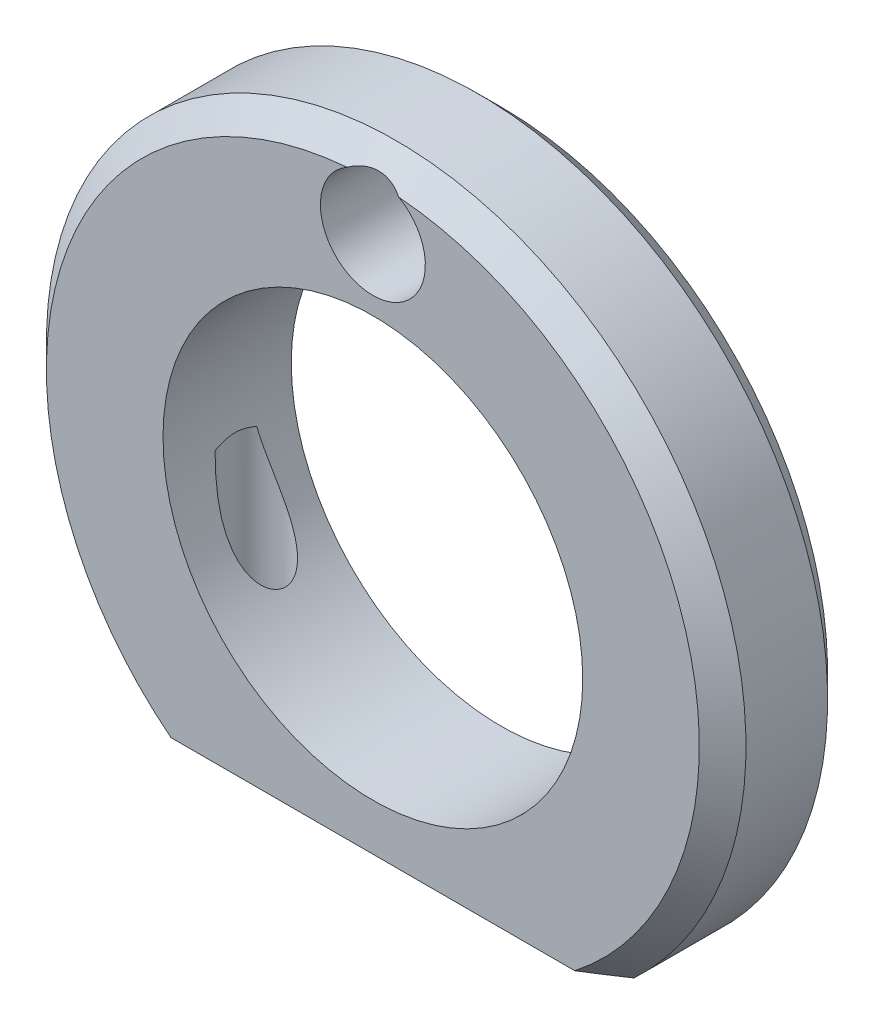
ISO-10303-21;
HEADER;
FILE_DESCRIPTION(('STEP AP214'),'2;1');
FILE_NAME('part.step','',(''),(''),'','','');
FILE_SCHEMA(('AUTOMOTIVE_DESIGN { 1 0 10303 214 1 1 1 1 }'));
ENDSEC;
DATA;
#1=APPLICATION_CONTEXT('core data for automotive mechanical design processes');
#2=APPLICATION_PROTOCOL_DEFINITION('international standard','automotive_design',2000,#1);
#3=PRODUCT_CONTEXT('',#1,'mechanical');
#4=PRODUCT('Part','Part','',(#3));
#5=PRODUCT_RELATED_PRODUCT_CATEGORY('part','',(#4));
#6=PRODUCT_DEFINITION_FORMATION('','',#4);
#7=PRODUCT_DEFINITION_CONTEXT('part definition',#1,'design');
#8=PRODUCT_DEFINITION('design','',#6,#7);
#9=PRODUCT_DEFINITION_SHAPE('','',#8);
#10=(LENGTH_UNIT() NAMED_UNIT(*) SI_UNIT(.MILLI.,.METRE.));
#11=(NAMED_UNIT(*) PLANE_ANGLE_UNIT() SI_UNIT($,.RADIAN.));
#12=(NAMED_UNIT(*) SI_UNIT($,.STERADIAN.) SOLID_ANGLE_UNIT());
#13=UNCERTAINTY_MEASURE_WITH_UNIT(LENGTH_MEASURE(1.E-05),#10,'distance_accuracy_value','');
#14=(GEOMETRIC_REPRESENTATION_CONTEXT(3) GLOBAL_UNCERTAINTY_ASSIGNED_CONTEXT((#13)) GLOBAL_UNIT_ASSIGNED_CONTEXT((#10,
#11,#12)) REPRESENTATION_CONTEXT('',''));
#15=CARTESIAN_POINT('',(0.,0.,0.));
#16=DIRECTION('',(0.,0.,1.));
#17=DIRECTION('',(1.,0.,0.));
#18=AXIS2_PLACEMENT_3D('',#15,#16,#17);
#19=CARTESIAN_POINT('',(0.,0.,-30.));
#20=DIRECTION('',(0.,0.,1.));
#21=DIRECTION('',(1.,0.,0.));
#22=AXIS2_PLACEMENT_3D('',#19,#20,#21);
#23=PLANE('',#22);
#24=CARTESIAN_POINT('',(0.,0.,-30.));
#25=DIRECTION('',(0.,0.,-1.));
#26=DIRECTION('',(-1.,0.,0.));
#27=AXIS2_PLACEMENT_3D('',#24,#25,#26);
#28=CIRCLE('',#27,9.);
#29=CARTESIAN_POINT('',(-9.,0.,-30.));
#30=VERTEX_POINT('',#29);
#31=EDGE_CURVE('E260',#30,#30,#28,.T.);
#32=ORIENTED_EDGE('',*,*,#31,.F.);
#33=EDGE_LOOP('',(#32));
#34=FACE_BOUND('',#33,.T.);
#35=CARTESIAN_POINT('',(0.,0.,-30.));
#36=DIRECTION('',(0.,0.,1.));
#37=DIRECTION('',(1.,0.,0.));
#38=AXIS2_PLACEMENT_3D('',#35,#36,#37);
#39=CIRCLE('',#38,14.);
#40=CARTESIAN_POINT('',(-8.66025403784439,-11.,-30.));
#41=VERTEX_POINT('',#40);
#42=CARTESIAN_POINT('',(-1.11248524783447,13.9557291666667,-30.));
#43=VERTEX_POINT('',#42);
#44=EDGE_CURVE('E52',#41,#43,#39,.F.);
#45=ORIENTED_EDGE('',*,*,#44,.T.);
#46=CARTESIAN_POINT('',(0.,12.,-30.));
#47=DIRECTION('',(0.,0.,1.));
#48=DIRECTION('',(1.,0.,0.));
#49=AXIS2_PLACEMENT_3D('',#46,#47,#48);
#50=CIRCLE('',#49,2.25);
#51=CARTESIAN_POINT('',(1.11248524783447,13.9557291666667,-30.));
#52=VERTEX_POINT('',#51);
#53=EDGE_CURVE('E64',#43,#52,#50,.T.);
#54=ORIENTED_EDGE('',*,*,#53,.T.);
#55=CARTESIAN_POINT('',(8.66025403784439,-11.,-30.));
#56=VERTEX_POINT('',#55);
#57=EDGE_CURVE('E112',#52,#56,#39,.F.);
#58=ORIENTED_EDGE('',*,*,#57,.T.);
#59=DIRECTION('',(1.,0.,0.));
#60=VECTOR('',#59,1.);
#61=CARTESIAN_POINT('',(-15.,-11.,-30.));
#62=LINE('',#61,#60);
#63=EDGE_CURVE('E181',#41,#56,#62,.T.);
#64=ORIENTED_EDGE('',*,*,#63,.F.);
#65=EDGE_LOOP('',(#45,#54,#58,#64));
#66=FACE_BOUND('',#65,.T.);
#67=ADVANCED_FACE('F38',(#34,#66),#23,.F.);
#68=CARTESIAN_POINT('',(0.,0.,-23.));
#69=DIRECTION('',(0.,0.,-1.));
#70=DIRECTION('',(-1.,0.,0.));
#71=AXIS2_PLACEMENT_3D('',#68,#69,#70);
#72=CYLINDRICAL_SURFACE('',#71,15.);
#73=DIRECTION('',(0.,0.,-1.));
#74=VECTOR('',#73,1.);
#75=CARTESIAN_POINT('',(-10.1980390271856,-11.,-23.));
#76=LINE('',#75,#74);
#77=CARTESIAN_POINT('',(-10.1980390271856,-11.,-29.));
#78=VERTEX_POINT('',#77);
#79=CARTESIAN_POINT('',(-10.1980390271856,-11.,-25.5));
#80=VERTEX_POINT('',#79);
#81=EDGE_CURVE('E179',#78,#80,#76,.F.);
#82=ORIENTED_EDGE('',*,*,#81,.T.);
#83=CARTESIAN_POINT('',(0.,0.,-25.5));
#84=DIRECTION('',(0.,0.,-1.));
#85=DIRECTION('',(-1.,0.,0.));
#86=AXIS2_PLACEMENT_3D('',#83,#84,#85);
#87=CIRCLE('',#86,15.);
#88=CARTESIAN_POINT('',(10.1980390271856,-11.,-25.5));
#89=VERTEX_POINT('',#88);
#90=EDGE_CURVE('E166',#80,#89,#87,.T.);
#91=ORIENTED_EDGE('',*,*,#90,.T.);
#92=DIRECTION('',(0.,0.,-1.));
#93=VECTOR('',#92,1.);
#94=CARTESIAN_POINT('',(10.1980390271856,-11.,-23.));
#95=LINE('',#94,#93);
#96=CARTESIAN_POINT('',(10.1980390271856,-11.,-29.));
#97=VERTEX_POINT('',#96);
#98=EDGE_CURVE('E175',#89,#97,#95,.T.);
#99=ORIENTED_EDGE('',*,*,#98,.T.);
#100=CARTESIAN_POINT('',(0.,0.,-29.));
#101=DIRECTION('',(0.,0.,1.));
#102=DIRECTION('',(1.,0.,0.));
#103=AXIS2_PLACEMENT_3D('',#100,#101,#102);
#104=CIRCLE('',#103,15.);
#105=EDGE_CURVE('E170',#97,#78,#104,.T.);
#106=ORIENTED_EDGE('',*,*,#105,.T.);
#107=EDGE_LOOP('',(#82,#91,#99,#106));
#108=FACE_BOUND('',#107,.T.);
#109=ADVANCED_FACE('F146',(#108),#72,.T.);
#110=CARTESIAN_POINT('',(-15.,-11.,-24.5));
#111=DIRECTION('',(0.,1.,0.));
#112=DIRECTION('',(0.,0.,1.));
#113=AXIS2_PLACEMENT_3D('',#110,#111,#112);
#114=PLANE('',#113);
#115=CARTESIAN_POINT('',(-8.,-11.,-27.5));
#116=DIRECTION('',(0.,-1.,0.));
#117=DIRECTION('',(0.,0.,-1.));
#118=AXIS2_PLACEMENT_3D('',#115,#116,#117);
#119=CIRCLE('',#118,1.24999999999999);
#120=CARTESIAN_POINT('',(-8.,-11.,-28.75));
#121=VERTEX_POINT('',#120);
#122=EDGE_CURVE('E195',#121,#121,#119,.T.);
#123=ORIENTED_EDGE('',*,*,#122,.F.);
#124=EDGE_LOOP('',(#123));
#125=FACE_BOUND('',#124,.T.);
#126=CARTESIAN_POINT('',(8.,-11.,-27.5));
#127=DIRECTION('',(0.,-1.,0.));
#128=DIRECTION('',(0.,0.,-1.));
#129=AXIS2_PLACEMENT_3D('',#126,#127,#128);
#130=CIRCLE('',#129,1.24999999999999);
#131=CARTESIAN_POINT('',(8.,-11.,-28.75));
#132=VERTEX_POINT('',#131);
#133=EDGE_CURVE('E189',#132,#132,#130,.T.);
#134=ORIENTED_EDGE('',*,*,#133,.F.);
#135=EDGE_LOOP('',(#134));
#136=FACE_BOUND('',#135,.T.);
#137=ORIENTED_EDGE('',*,*,#98,.F.);
#138=CARTESIAN_POINT('',(10.1980390271856,-11.,-25.5));
#139=CARTESIAN_POINT('',(10.0716097932226,-11.,-25.4140465014491));
#140=CARTESIAN_POINT('',(9.94478168559514,-11.,-25.3286777286267));
#141=CARTESIAN_POINT('',(9.69029386318123,-11.,-25.1592213451996));
#142=CARTESIAN_POINT('',(9.56263424634969,-11.,-25.0751335874483));
#143=CARTESIAN_POINT('',(9.30641873923805,-11.,-24.908329983576));
#144=CARTESIAN_POINT('',(9.17786283805277,-11.,-24.8256141541888));
#145=CARTESIAN_POINT('',(8.91978924484244,-11.,-24.6616638992506));
#146=CARTESIAN_POINT('',(8.79027144318523,-11.,-24.5804296463243));
#147=CARTESIAN_POINT('',(8.66025403784439,-11.,-24.5));
#148=B_SPLINE_CURVE_WITH_KNOTS('',3,(#138,#139,#140,#141,#142,#143,#144,#145,#146,#147),
.UNSPECIFIED.,.F.,.F.,(4,2,2,2,4),(0.,0.458640555019234,0.917228023923435,1.3758210822705,
1.83446723618274),.UNSPECIFIED.);
#149=CARTESIAN_POINT('',(8.66025403784439,-11.,-24.5));
#150=VERTEX_POINT('',#149);
#151=EDGE_CURVE('E124',#89,#150,#148,.T.);
#152=ORIENTED_EDGE('',*,*,#151,.T.);
#153=DIRECTION('',(1.,0.,0.));
#154=VECTOR('',#153,1.);
#155=CARTESIAN_POINT('',(-15.,-11.,-24.5));
#156=LINE('',#155,#154);
#157=CARTESIAN_POINT('',(-8.66025403784439,-11.,-24.5));
#158=VERTEX_POINT('',#157);
#159=EDGE_CURVE('E182',#158,#150,#156,.T.);
#160=ORIENTED_EDGE('',*,*,#159,.F.);
#161=CARTESIAN_POINT('',(-8.66025403784439,-11.,-24.5));
#162=CARTESIAN_POINT('',(-8.79027144318523,-11.,-24.5804296463243));
#163=CARTESIAN_POINT('',(-8.91978924484244,-11.,-24.6616638992506));
#164=CARTESIAN_POINT('',(-9.17786283805277,-11.,-24.8256141541888));
#165=CARTESIAN_POINT('',(-9.30641873923805,-11.,-24.908329983576));
#166=CARTESIAN_POINT('',(-9.56263424634969,-11.,-25.0751335874483));
#167=CARTESIAN_POINT('',(-9.69029386318122,-11.,-25.1592213451996));
#168=CARTESIAN_POINT('',(-9.94478168559514,-11.,-25.3286777286267));
#169=CARTESIAN_POINT('',(-10.0716097932226,-11.,-25.4140465014491));
#170=CARTESIAN_POINT('',(-10.1980390271856,-11.,-25.5));
#171=B_SPLINE_CURVE_WITH_KNOTS('',3,(#161,#162,#163,#164,#165,#166,#167,#168,#169,#170),
.UNSPECIFIED.,.F.,.F.,(4,2,2,2,4),(0.,0.458646153912242,0.917239212259307,1.37582668116351,
1.83446723618274),.UNSPECIFIED.);
#172=EDGE_CURVE('E131',#158,#80,#171,.T.);
#173=ORIENTED_EDGE('',*,*,#172,.T.);
#174=ORIENTED_EDGE('',*,*,#81,.F.);
#175=CARTESIAN_POINT('',(-10.1980390271856,-11.,-29.));
#176=CARTESIAN_POINT('',(-10.0716097932226,-11.,-29.0859534985509));
#177=CARTESIAN_POINT('',(-9.94478168559514,-11.,-29.1713222713733));
#178=CARTESIAN_POINT('',(-9.69029386318123,-11.,-29.3407786548004));
#179=CARTESIAN_POINT('',(-9.56263424634969,-11.,-29.4248664125517));
#180=CARTESIAN_POINT('',(-9.30641873923805,-11.,-29.591670016424));
#181=CARTESIAN_POINT('',(-9.17786283805277,-11.,-29.6743858458112));
#182=CARTESIAN_POINT('',(-8.91978924484244,-11.,-29.8383361007494));
#183=CARTESIAN_POINT('',(-8.79027144318522,-11.,-29.9195703536757));
#184=CARTESIAN_POINT('',(-8.66025403784439,-11.,-30.));
#185=B_SPLINE_CURVE_WITH_KNOTS('',3,(#175,#176,#177,#178,#179,#180,#181,#182,#183,#184),
.UNSPECIFIED.,.F.,.F.,(4,2,2,2,4),(0.,0.458640555019234,0.917228023923435,1.3758210822705,
1.83446723618274),.UNSPECIFIED.);
#186=EDGE_CURVE('E159',#78,#41,#185,.T.);
#187=ORIENTED_EDGE('',*,*,#186,.T.);
#188=ORIENTED_EDGE('',*,*,#63,.T.);
#189=CARTESIAN_POINT('',(8.66025403784439,-11.,-30.));
#190=CARTESIAN_POINT('',(8.79027144318522,-11.,-29.9195703536757));
#191=CARTESIAN_POINT('',(8.91978924484244,-11.,-29.8383361007494));
#192=CARTESIAN_POINT('',(9.17786283805277,-11.,-29.6743858458112));
#193=CARTESIAN_POINT('',(9.30641873923805,-11.,-29.591670016424));
#194=CARTESIAN_POINT('',(9.56263424634969,-11.,-29.4248664125517));
#195=CARTESIAN_POINT('',(9.69029386318123,-11.,-29.3407786548004));
#196=CARTESIAN_POINT('',(9.94478168559515,-11.,-29.1713222713733));
#197=CARTESIAN_POINT('',(10.0716097932226,-11.,-29.0859534985509));
#198=CARTESIAN_POINT('',(10.1980390271856,-11.,-29.));
#199=B_SPLINE_CURVE_WITH_KNOTS('',3,(#189,#190,#191,#192,#193,#194,#195,#196,#197,#198),
.UNSPECIFIED.,.F.,.F.,(4,2,2,2,4),(0.,0.458646153912241,0.917239212259307,1.37582668116351,
1.83446723618274),.UNSPECIFIED.);
#200=EDGE_CURVE('E118',#56,#97,#199,.T.);
#201=ORIENTED_EDGE('',*,*,#200,.T.);
#202=EDGE_LOOP('',(#137,#152,#160,#173,#174,#187,#188,#201));
#203=FACE_BOUND('',#202,.T.);
#204=ADVANCED_FACE('F140',(#125,#136,#203),#114,.F.);
#205=CARTESIAN_POINT('',(8.,-1.50000000000002,-27.5));
#206=DIRECTION('',(0.,-1.,0.));
#207=DIRECTION('',(0.,0.,-1.));
#208=AXIS2_PLACEMENT_3D('',#205,#206,#207);
#209=CONICAL_SURFACE('',#208,1.25,1.02974425867665);
#210=CARTESIAN_POINT('',(8.,-1.50000000000002,-27.5));
#211=DIRECTION('',(0.,-1.,0.));
#212=DIRECTION('',(0.,0.,-1.));
#213=AXIS2_PLACEMENT_3D('',#210,#211,#212);
#214=CIRCLE('',#213,1.25);
#215=CARTESIAN_POINT('',(8.87411967464942,-1.50000000000002,-28.3935405947078));
#216=VERTEX_POINT('',#215);
#217=CARTESIAN_POINT('',(8.87411967464942,-1.50000000000002,-26.6064594052922));
#218=VERTEX_POINT('',#217);
#219=EDGE_CURVE('E185',#216,#218,#214,.T.);
#220=ORIENTED_EDGE('',*,*,#219,.T.);
#221=CARTESIAN_POINT('',(8.86106122519498,-1.57530757737848,-26.4275663046257));
#222=CARTESIAN_POINT('',(8.86361566752957,-1.56094003834773,-26.4602890018099));
#223=CARTESIAN_POINT('',(8.86609058147292,-1.54681453610574,-26.4931239838151));
#224=CARTESIAN_POINT('',(8.87087174635954,-1.51915470452756,-26.559063843349));
#225=CARTESIAN_POINT('',(8.87317795349055,-1.5056205291207,-26.5921687885222));
#226=CARTESIAN_POINT('',(8.87984990162628,-1.4659415614311,-26.6922721352683));
#227=CARTESIAN_POINT('',(8.88394254666435,-1.4408700172651,-26.7597241566238));
#228=CARTESIAN_POINT('',(8.89123578849562,-1.39515452702232,-26.8953921180772));
#229=CARTESIAN_POINT('',(8.89444536076115,-1.37446656409503,-26.9635924372257));
#230=CARTESIAN_POINT('',(8.8998432520033,-1.33907222296339,-27.1014942553577));
#231=CARTESIAN_POINT('',(8.90203360474662,-1.32435394036727,-27.1711924719693));
#232=CARTESIAN_POINT('',(8.90480765394282,-1.30555302442072,-27.2946804252001));
#233=CARTESIAN_POINT('',(8.90565312498818,-1.29975056316816,-27.3481970376761));
#234=CARTESIAN_POINT('',(8.90658287025973,-1.29336510130989,-27.4555565941321));
#235=CARTESIAN_POINT('',(8.90666721269013,-1.2927816330338,-27.5093995084397));
#236=CARTESIAN_POINT('',(8.90606712586658,-1.29690857674494,-27.6169138398362));
#237=CARTESIAN_POINT('',(8.90538206378273,-1.30162334649805,-27.6705850792886));
#238=CARTESIAN_POINT('',(8.90329669120279,-1.31581070616334,-27.777277081794));
#239=CARTESIAN_POINT('',(8.90189613544496,-1.32528492753385,-27.8302976154076));
#240=CARTESIAN_POINT('',(8.89823890619905,-1.34963458663474,-27.9424520793815));
#241=CARTESIAN_POINT('',(8.89589311023684,-1.36506099471586,-28.0014606615901));
#242=CARTESIAN_POINT('',(8.8905197062628,-1.39963051090123,-28.1183604287142));
#243=CARTESIAN_POINT('',(8.88749165652942,-1.41877602580943,-28.1762508632087));
#244=CARTESIAN_POINT('',(8.88085338113834,-1.45975044087702,-28.2910586983109));
#245=CARTESIAN_POINT('',(8.87724283945837,-1.48158079611952,-28.3479755520721));
#246=CARTESIAN_POINT('',(8.86951569004325,-1.52716672313604,-28.4608468301184));
#247=CARTESIAN_POINT('',(8.8654002893288,-1.55091765852062,-28.5168031989002));
#248=CARTESIAN_POINT('',(8.86106122519498,-1.57530757737846,-28.5724336953742));
#249=B_SPLINE_CURVE_WITH_KNOTS('',3,(#221,#222,#223,#224,#225,#226,#227,#228,#229,#230,#231,
#232,#233,#234,#235,#236,#237,#238,#239,#240,#241,#242,#243,#244,#245,#246,#247,#248),
.UNSPECIFIED.,.F.,.F.,(4,2,2,2,2,2,2,2,2,2,2,2,2,4),(0.,0.107484795997813,0.21499740685303,
0.43112518645645,0.644967483157521,0.858381226150281,1.01966031237344,1.18092494634404,
1.34232231655745,1.50377504880878,1.68671209699813,1.86976792889765,2.05292341105545,
2.23564923905379),.UNSPECIFIED.);
#250=EDGE_CURVE('E198',#218,#216,#249,.T.);
#251=ORIENTED_EDGE('',*,*,#250,.T.);
#252=EDGE_LOOP('',(#220,#251));
#253=FACE_BOUND('',#252,.T.);
#254=ADVANCED_FACE('F145',(#253),#209,.F.);
#255=CARTESIAN_POINT('',(8.,-11.,-27.5));
#256=DIRECTION('',(0.,-1.,0.));
#257=DIRECTION('',(0.,0.,-1.));
#258=AXIS2_PLACEMENT_3D('',#255,#256,#257);
#259=CYLINDRICAL_SURFACE('',#258,1.24999999999999);
#260=ORIENTED_EDGE('',*,*,#219,.F.);
#261=CARTESIAN_POINT('',(8.87411967464942,-1.50000000000002,-28.3935405947078));
#262=CARTESIAN_POINT('',(8.85708328523695,-1.6007755749857,-28.4102155974332));
#263=CARTESIAN_POINT('',(8.83835554615178,-1.70113872994846,-28.4275735857014));
#264=CARTESIAN_POINT('',(8.79752008243259,-1.90106765132002,-28.4629054350056));
#265=CARTESIAN_POINT('',(8.77541232661505,-2.00063341036326,-28.4808793017224));
#266=CARTESIAN_POINT('',(8.70385384490105,-2.29888060983939,-28.5347268180978));
#267=CARTESIAN_POINT('',(8.64928941017002,-2.49639332409706,-28.5703967028258));
#268=CARTESIAN_POINT('',(8.52431976444913,-2.89500688881718,-28.6370109661542));
#269=CARTESIAN_POINT('',(8.45342967450551,-3.09599366382335,-28.6677478792078));
#270=CARTESIAN_POINT('',(8.33615429625324,-3.3940998035778,-28.7046459380422));
#271=CARTESIAN_POINT('',(8.29527458916372,-3.49283190549684,-28.7154060168352));
#272=CARTESIAN_POINT('',(8.2098894739385,-3.68905915831004,-28.7330239431371));
#273=CARTESIAN_POINT('',(8.165384906513,-3.78655458999567,-28.7398826925479));
#274=CARTESIAN_POINT('',(8.07334229593198,-3.97899370523011,-28.7486931227266));
#275=CARTESIAN_POINT('',(8.02584402675978,-4.07395375798958,-28.7506991573559));
#276=CARTESIAN_POINT('',(7.92754897671645,-4.26206757611571,-28.7488663624839));
#277=CARTESIAN_POINT('',(7.87675363631021,-4.35522210750634,-28.7450300692132));
#278=CARTESIAN_POINT('',(7.77263043180039,-4.53841490538821,-28.7302615672639));
#279=CARTESIAN_POINT('',(7.71933055222094,-4.62847411161763,-28.719395762287));
#280=CARTESIAN_POINT('',(7.61033057764768,-4.80558597309028,-28.6890572263881));
#281=CARTESIAN_POINT('',(7.55463293321618,-4.8926415414956,-28.6695931030931));
#282=CARTESIAN_POINT('',(7.44756877966817,-5.05391844926578,-28.6226632925019));
#283=CARTESIAN_POINT('',(7.39635182913236,-5.12853471600345,-28.5962362484831));
#284=CARTESIAN_POINT('',(7.29368403850661,-5.27352499250148,-28.5330814793777));
#285=CARTESIAN_POINT('',(7.24223293142836,-5.34388880825062,-28.4963301090838));
#286=CARTESIAN_POINT('',(7.14041748909151,-5.47920538204426,-28.410022795025));
#287=CARTESIAN_POINT('',(7.09007655919198,-5.54407417126059,-28.3603037744454));
#288=CARTESIAN_POINT('',(6.99454613026873,-5.66411052189057,-28.2463480666901));
#289=CARTESIAN_POINT('',(6.9493351104457,-5.71931918149558,-28.1821756772732));
#290=CARTESIAN_POINT('',(6.88612727722796,-5.79504770014483,-28.0692245541152));
#291=CARTESIAN_POINT('',(6.86473990234609,-5.82032815276168,-28.0255268342084));
#292=CARTESIAN_POINT('',(6.82648544946824,-5.86514780552809,-27.9334098844887));
#293=CARTESIAN_POINT('',(6.80961591930785,-5.88469012074157,-27.8849932355279));
#294=CARTESIAN_POINT('',(6.78152083944794,-5.91704711501855,-27.7838699958307));
#295=CARTESIAN_POINT('',(6.77034490696607,-5.92980269185769,-27.7311301908117));
#296=CARTESIAN_POINT('',(6.75491526698757,-5.94737446502618,-27.6233593114046));
#297=CARTESIAN_POINT('',(6.75065590871298,-5.95219714250368,-27.5683301451443));
#298=CARTESIAN_POINT('',(6.74955513456626,-5.95344450624295,-27.4648082390818));
#299=CARTESIAN_POINT('',(6.75187693980968,-5.95081651701455,-27.4163319430734));
#300=CARTESIAN_POINT('',(6.76198982631269,-5.93932246663234,-27.3207202606378));
#301=CARTESIAN_POINT('',(6.76978083127581,-5.9304564924997,-27.2735848555144));
#302=CARTESIAN_POINT('',(6.79002457882441,-5.90726615786427,-27.1828609147258));
#303=CARTESIAN_POINT('',(6.8023758992209,-5.89306043839874,-27.1392186533023));
#304=CARTESIAN_POINT('',(6.83098204361698,-5.85987754338299,-27.0551726476339));
#305=CARTESIAN_POINT('',(6.8472383828719,-5.84089851552241,-27.0147701686514));
#306=CARTESIAN_POINT('',(6.89099309420711,-5.78928397123099,-26.9199698019241));
#307=CARTESIAN_POINT('',(6.92023406769393,-5.75437107560637,-26.8676133155812));
#308=CARTESIAN_POINT('',(6.98303449192455,-5.67800065704733,-26.7708737998814));
#309=CARTESIAN_POINT('',(7.01660350986967,-5.63652858749242,-26.72650897323));
#310=CARTESIAN_POINT('',(7.10285868224077,-5.52776561919175,-26.6259989700178));
#311=CARTESIAN_POINT('',(7.15704001136858,-5.45758009537778,-26.5742951459052));
#312=CARTESIAN_POINT('',(7.26713457811662,-5.31011174866885,-26.4848869012029));
#313=CARTESIAN_POINT('',(7.32305098128383,-5.23281537827303,-26.447209923295));
#314=CARTESIAN_POINT('',(7.42535836799345,-5.0863252750604,-26.3886198267418));
#315=CARTESIAN_POINT('',(7.4718225643357,-5.01785227997352,-26.3659784714355));
#316=CARTESIAN_POINT('',(7.56368795346398,-4.87827946301278,-26.3275610278762));
#317=CARTESIAN_POINT('',(7.60908838989865,-4.80717785952706,-26.3117896920706));
#318=CARTESIAN_POINT('',(7.69836049844633,-4.66288066996903,-26.2860502466067));
#319=CARTESIAN_POINT('',(7.74222996682389,-4.58968232091245,-26.2760902022262));
#320=CARTESIAN_POINT('',(7.82808011145286,-4.44167660634974,-26.2611133040344));
#321=CARTESIAN_POINT('',(7.87006007410449,-4.36686864845668,-26.2560983030882));
#322=CARTESIAN_POINT('',(7.98762681311368,-4.1501344551804,-26.2476960913835));
#323=CARTESIAN_POINT('',(8.06059241842558,-4.00657252613277,-26.2495430598587));
#324=CARTESIAN_POINT('',(8.19854202015398,-3.71615674617172,-26.2639233429438));
#325=CARTESIAN_POINT('',(8.26351866126316,-3.56930000668576,-26.2764664222273));
#326=CARTESIAN_POINT('',(8.38539505310234,-3.27275175073386,-26.3092198048271));
#327=CARTESIAN_POINT('',(8.44227613290657,-3.12305455565661,-26.3294474495327));
#328=CARTESIAN_POINT('',(8.5477447019725,-2.8216230660789,-26.3749352586297));
#329=CARTESIAN_POINT('',(8.59633544743443,-2.66988959674315,-26.4001934386868));
#330=CARTESIAN_POINT('',(8.68968149811894,-2.34945933835957,-26.4559350073354));
#331=CARTESIAN_POINT('',(8.73358915250647,-2.18056229674849,-26.4866879880508));
#332=CARTESIAN_POINT('',(8.79192570677171,-1.92602135509888,-26.5325487115759));
#333=CARTESIAN_POINT('',(8.81007421561503,-1.84122871737723,-26.5477460891529));
#334=CARTESIAN_POINT('',(8.84392954208174,-1.67105705152311,-26.5776148593848));
#335=CARTESIAN_POINT('',(8.85963612317073,-1.58567796742057,-26.59228620098));
#336=CARTESIAN_POINT('',(8.87411967464942,-1.50000000000002,-26.6064594052922));
#337=B_SPLINE_CURVE_WITH_KNOTS('',3,(#261,#262,#263,#264,#265,#266,#267,#268,#269,#270,#271,
#272,#273,#274,#275,#276,#277,#278,#279,#280,#281,#282,#283,#284,#285,#286,#287,#288,#289,#290,
#291,#292,#293,#294,#295,#296,#297,#298,#299,#300,#301,#302,#303,#304,#305,#306,#307,#308,#309,
#310,#311,#312,#313,#314,#315,#316,#317,#318,#319,#320,#321,#322,#323,#324,#325,#326,#327,#328,
#329,#330,#331,#332,#333,#334,#335,#336),.UNSPECIFIED.,.F.,.F.,(4,2,2,2,2,2,2,2,2,2,2,2,2,2,2,2,
2,2,2,2,2,2,2,2,2,2,2,2,2,2,2,2,2,2,2,2,2,4),(0.,0.310631637156385,0.621266140325088,
1.24475142220558,1.8899184443281,2.21200932792036,2.53402572086116,2.85241825048372,
3.17067260115902,3.48596363908503,3.80093975738901,4.08326410499949,4.36624039028637,
4.65296296322747,4.93843435963055,5.10234609950026,5.26616869135074,5.43139550026636,
5.59648725234872,5.74156233820096,5.88663540026624,6.028659314912,6.17073842803876,
6.37774327121526,6.58521380903381,6.89141847932309,7.19821911110901,7.4552312436013,
7.71242088714413,7.96996663086809,8.22760883812741,8.70995030699621,9.19273258613571,
9.67661087138331,10.1602986637118,10.6915726954795,10.955645804923,11.2197444775744),.UNSPECIFIED.);
#338=EDGE_CURVE('E206',#216,#218,#337,.T.);
#339=ORIENTED_EDGE('',*,*,#338,.T.);
#340=EDGE_LOOP('',(#260,#339));
#341=FACE_BOUND('',#340,.T.);
#342=ORIENTED_EDGE('',*,*,#133,.T.);
#343=EDGE_LOOP('',(#342));
#344=FACE_BOUND('',#343,.T.);
#345=ADVANCED_FACE('F241',(#341,#344),#259,.F.);
#346=CARTESIAN_POINT('',(-8.,-1.50000000000002,-27.5));
#347=DIRECTION('',(0.,-1.,0.));
#348=DIRECTION('',(0.,0.,-1.));
#349=AXIS2_PLACEMENT_3D('',#346,#347,#348);
#350=CONICAL_SURFACE('',#349,1.25,1.02974425867665);
#351=CARTESIAN_POINT('',(-8.,-1.50000000000002,-27.5));
#352=DIRECTION('',(0.,-1.,0.));
#353=DIRECTION('',(0.,0.,-1.));
#354=AXIS2_PLACEMENT_3D('',#351,#352,#353);
#355=CIRCLE('',#354,1.25);
#356=CARTESIAN_POINT('',(-8.87411967464942,-1.50000000000002,-26.6064594052922));
#357=VERTEX_POINT('',#356);
#358=CARTESIAN_POINT('',(-8.87411967464942,-1.50000000000002,-28.3935405947078));
#359=VERTEX_POINT('',#358);
#360=EDGE_CURVE('E192',#357,#359,#355,.T.);
#361=ORIENTED_EDGE('',*,*,#360,.T.);
#362=CARTESIAN_POINT('',(-8.86106122519498,-1.57530757737846,-28.5724336953742));
#363=CARTESIAN_POINT('',(-8.86361566752957,-1.56094003834771,-28.5397109981901));
#364=CARTESIAN_POINT('',(-8.86609058147292,-1.54681453610573,-28.5068760161848));
#365=CARTESIAN_POINT('',(-8.87087174635954,-1.51915470452754,-28.440936156651));
#366=CARTESIAN_POINT('',(-8.87317795349055,-1.50562052912068,-28.4078312114778));
#367=CARTESIAN_POINT('',(-8.87984990162628,-1.46594156143109,-28.3077278647317));
#368=CARTESIAN_POINT('',(-8.88394254666436,-1.44087001726509,-28.2402758433762));
#369=CARTESIAN_POINT('',(-8.89123578849562,-1.3951545270223,-28.1046078819227));
#370=CARTESIAN_POINT('',(-8.89444536076115,-1.37446656409502,-28.0364075627743));
#371=CARTESIAN_POINT('',(-8.8998432520033,-1.33907222296338,-27.8985057446422));
#372=CARTESIAN_POINT('',(-8.90203360474662,-1.32435394036726,-27.8288075280307));
#373=CARTESIAN_POINT('',(-8.90480765394282,-1.30555302442071,-27.7053195747999));
#374=CARTESIAN_POINT('',(-8.90565312498818,-1.29975056316816,-27.6518029623239));
#375=CARTESIAN_POINT('',(-8.90658287025973,-1.29336510130989,-27.5444434058679));
#376=CARTESIAN_POINT('',(-8.90666721269013,-1.2927816330338,-27.4906004915603));
#377=CARTESIAN_POINT('',(-8.90606712586657,-1.29690857674494,-27.3830861601638));
#378=CARTESIAN_POINT('',(-8.90538206378273,-1.30162334649806,-27.3294149207114));
#379=CARTESIAN_POINT('',(-8.90329669120279,-1.31581070616334,-27.222722918206));
#380=CARTESIAN_POINT('',(-8.90189613544496,-1.32528492753385,-27.1697023845924));
#381=CARTESIAN_POINT('',(-8.89823890619905,-1.34963458663475,-27.0575479206184));
#382=CARTESIAN_POINT('',(-8.89589311023684,-1.36506099471587,-26.9985393384099));
#383=CARTESIAN_POINT('',(-8.8905197062628,-1.39963051090124,-26.8816395712858));
#384=CARTESIAN_POINT('',(-8.88749165652942,-1.41877602580945,-26.8237491367913));
#385=CARTESIAN_POINT('',(-8.88085338113834,-1.45975044087703,-26.708941301689));
#386=CARTESIAN_POINT('',(-8.87724283945837,-1.48158079611954,-26.6520244479279));
#387=CARTESIAN_POINT('',(-8.86951569004325,-1.52716672313605,-26.5391531698816));
#388=CARTESIAN_POINT('',(-8.86540028932879,-1.55091765852064,-26.4831968010997));
#389=CARTESIAN_POINT('',(-8.86106122519498,-1.57530757737848,-26.4275663046257));
#390=B_SPLINE_CURVE_WITH_KNOTS('',3,(#362,#363,#364,#365,#366,#367,#368,#369,#370,#371,#372,
#373,#374,#375,#376,#377,#378,#379,#380,#381,#382,#383,#384,#385,#386,#387,#388,#389),
.UNSPECIFIED.,.F.,.F.,(4,2,2,2,2,2,2,2,2,2,2,2,2,4),(0.,0.107484795997809,0.214997406853026,
0.431125186456445,0.644967483157522,0.85838122615027,1.01966031237343,1.18092494634404,
1.34232231655745,1.50377504880878,1.68671209699812,1.86976792889765,2.05292341105545,
2.23564923905379),.UNSPECIFIED.);
#391=EDGE_CURVE('E230',#359,#357,#390,.T.);
#392=ORIENTED_EDGE('',*,*,#391,.T.);
#393=EDGE_LOOP('',(#361,#392));
#394=FACE_BOUND('',#393,.T.);
#395=ADVANCED_FACE('F237',(#394),#350,.F.);
#396=CARTESIAN_POINT('',(-8.,-11.,-27.5));
#397=DIRECTION('',(0.,-1.,0.));
#398=DIRECTION('',(0.,0.,-1.));
#399=AXIS2_PLACEMENT_3D('',#396,#397,#398);
#400=CYLINDRICAL_SURFACE('',#399,1.24999999999999);
#401=ORIENTED_EDGE('',*,*,#360,.F.);
#402=CARTESIAN_POINT('',(-8.87411967464942,-1.50000000000002,-26.6064594052922));
#403=CARTESIAN_POINT('',(-8.85708328523695,-1.6007755749857,-26.5897844025668));
#404=CARTESIAN_POINT('',(-8.83835554615178,-1.70113872994846,-26.5724264142986));
#405=CARTESIAN_POINT('',(-8.79752008243259,-1.90106765132002,-26.5370945649944));
#406=CARTESIAN_POINT('',(-8.77541232661505,-2.00063341036326,-26.5191206982776));
#407=CARTESIAN_POINT('',(-8.70385384490105,-2.29888060983939,-26.4652731819022));
#408=CARTESIAN_POINT('',(-8.64928941017002,-2.49639332409706,-26.4296032971742));
#409=CARTESIAN_POINT('',(-8.52431976444913,-2.89500688881718,-26.3629890338458));
#410=CARTESIAN_POINT('',(-8.45342967450551,-3.09599366382335,-26.3322521207922));
#411=CARTESIAN_POINT('',(-8.33615429625324,-3.3940998035778,-26.2953540619578));
#412=CARTESIAN_POINT('',(-8.29527458916372,-3.49283190549684,-26.2845939831648));
#413=CARTESIAN_POINT('',(-8.2098894739385,-3.68905915831004,-26.2669760568629));
#414=CARTESIAN_POINT('',(-8.165384906513,-3.78655458999567,-26.2601173074521));
#415=CARTESIAN_POINT('',(-8.07334229593198,-3.97899370523011,-26.2513068772734));
#416=CARTESIAN_POINT('',(-8.02584402675978,-4.07395375798958,-26.2493008426441));
#417=CARTESIAN_POINT('',(-7.92754897671645,-4.26206757611571,-26.2511336375161));
#418=CARTESIAN_POINT('',(-7.87675363631021,-4.35522210750634,-26.2549699307868));
#419=CARTESIAN_POINT('',(-7.77263043180039,-4.53841490538821,-26.2697384327361));
#420=CARTESIAN_POINT('',(-7.71933055222094,-4.62847411161763,-26.280604237713));
#421=CARTESIAN_POINT('',(-7.61033057764768,-4.80558597309028,-26.3109427736119));
#422=CARTESIAN_POINT('',(-7.55463293321618,-4.8926415414956,-26.3304068969069));
#423=CARTESIAN_POINT('',(-7.44756877966817,-5.05391844926578,-26.3773367074981));
#424=CARTESIAN_POINT('',(-7.39635182913236,-5.12853471600345,-26.4037637515169));
#425=CARTESIAN_POINT('',(-7.29368403850661,-5.27352499250148,-26.4669185206223));
#426=CARTESIAN_POINT('',(-7.24223293142836,-5.34388880825062,-26.5036698909162));
#427=CARTESIAN_POINT('',(-7.14041748909151,-5.47920538204426,-26.589977204975));
#428=CARTESIAN_POINT('',(-7.09007655919198,-5.54407417126059,-26.6396962255546));
#429=CARTESIAN_POINT('',(-6.99454613026873,-5.66411052189057,-26.7536519333099));
#430=CARTESIAN_POINT('',(-6.9493351104457,-5.71931918149558,-26.8178243227268));
#431=CARTESIAN_POINT('',(-6.88612727722796,-5.79504770014483,-26.9307754458848));
#432=CARTESIAN_POINT('',(-6.86473990234609,-5.82032815276168,-26.9744731657916));
#433=CARTESIAN_POINT('',(-6.82648544946824,-5.86514780552809,-27.0665901155113));
#434=CARTESIAN_POINT('',(-6.80961591930785,-5.88469012074157,-27.1150067644721));
#435=CARTESIAN_POINT('',(-6.78152083944794,-5.91704711501855,-27.2161300041693));
#436=CARTESIAN_POINT('',(-6.77034490696607,-5.92980269185769,-27.2688698091883));
#437=CARTESIAN_POINT('',(-6.75491526698757,-5.94737446502618,-27.3766406885954));
#438=CARTESIAN_POINT('',(-6.75065590871298,-5.95219714250368,-27.4316698548557));
#439=CARTESIAN_POINT('',(-6.74955513456626,-5.95344450624295,-27.5351917609182));
#440=CARTESIAN_POINT('',(-6.75187693980968,-5.95081651701455,-27.5836680569266));
#441=CARTESIAN_POINT('',(-6.76198982631269,-5.93932246663234,-27.6792797393622));
#442=CARTESIAN_POINT('',(-6.76978083127581,-5.9304564924997,-27.7264151444856));
#443=CARTESIAN_POINT('',(-6.79002457882441,-5.90726615786427,-27.8171390852742));
#444=CARTESIAN_POINT('',(-6.8023758992209,-5.89306043839874,-27.8607813466977));
#445=CARTESIAN_POINT('',(-6.83098204361698,-5.85987754338299,-27.9448273523661));
#446=CARTESIAN_POINT('',(-6.8472383828719,-5.84089851552241,-27.9852298313486));
#447=CARTESIAN_POINT('',(-6.89099309420711,-5.78928397123099,-28.0800301980759));
#448=CARTESIAN_POINT('',(-6.92023406769393,-5.75437107560637,-28.1323866844188));
#449=CARTESIAN_POINT('',(-6.98303449192455,-5.67800065704733,-28.2291262001186));
#450=CARTESIAN_POINT('',(-7.01660350986967,-5.63652858749242,-28.27349102677));
#451=CARTESIAN_POINT('',(-7.10285868224077,-5.52776561919175,-28.3740010299822));
#452=CARTESIAN_POINT('',(-7.15704001136858,-5.45758009537778,-28.4257048540948));
#453=CARTESIAN_POINT('',(-7.26713457811662,-5.31011174866885,-28.5151130987971));
#454=CARTESIAN_POINT('',(-7.32305098128383,-5.23281537827302,-28.552790076705));
#455=CARTESIAN_POINT('',(-7.42535836799345,-5.0863252750604,-28.6113801732582));
#456=CARTESIAN_POINT('',(-7.4718225643357,-5.01785227997352,-28.6340215285645));
#457=CARTESIAN_POINT('',(-7.56368795346398,-4.87827946301278,-28.6724389721238));
#458=CARTESIAN_POINT('',(-7.60908838989865,-4.80717785952706,-28.6882103079294));
#459=CARTESIAN_POINT('',(-7.69836049844633,-4.66288066996903,-28.7139497533933));
#460=CARTESIAN_POINT('',(-7.74222996682389,-4.58968232091245,-28.7239097977738));
#461=CARTESIAN_POINT('',(-7.82808011145286,-4.44167660634974,-28.7388866959656));
#462=CARTESIAN_POINT('',(-7.87006007410449,-4.36686864845668,-28.7439016969118));
#463=CARTESIAN_POINT('',(-7.98762681311368,-4.1501344551804,-28.7523039086165));
#464=CARTESIAN_POINT('',(-8.06059241842558,-4.00657252613277,-28.7504569401413));
#465=CARTESIAN_POINT('',(-8.19854202015398,-3.71615674617172,-28.7360766570562));
#466=CARTESIAN_POINT('',(-8.26351866126316,-3.56930000668576,-28.7235335777727));
#467=CARTESIAN_POINT('',(-8.38539505310234,-3.27275175073386,-28.6907801951729));
#468=CARTESIAN_POINT('',(-8.44227613290657,-3.12305455565661,-28.6705525504673));
#469=CARTESIAN_POINT('',(-8.5477447019725,-2.8216230660789,-28.6250647413703));
#470=CARTESIAN_POINT('',(-8.59633544743443,-2.66988959674315,-28.5998065613132));
#471=CARTESIAN_POINT('',(-8.68968149811894,-2.34945933835957,-28.5440649926646));
#472=CARTESIAN_POINT('',(-8.73358915250647,-2.18056229674849,-28.5133120119492));
#473=CARTESIAN_POINT('',(-8.79192570677171,-1.92602135509888,-28.4674512884241));
#474=CARTESIAN_POINT('',(-8.81007421561503,-1.84122871737723,-28.4522539108471));
#475=CARTESIAN_POINT('',(-8.84392954208174,-1.67105705152311,-28.4223851406152));
#476=CARTESIAN_POINT('',(-8.85963612317073,-1.58567796742057,-28.40771379902));
#477=CARTESIAN_POINT('',(-8.87411967464942,-1.50000000000002,-28.3935405947078));
#478=B_SPLINE_CURVE_WITH_KNOTS('',3,(#402,#403,#404,#405,#406,#407,#408,#409,#410,#411,#412,
#413,#414,#415,#416,#417,#418,#419,#420,#421,#422,#423,#424,#425,#426,#427,#428,#429,#430,#431,
#432,#433,#434,#435,#436,#437,#438,#439,#440,#441,#442,#443,#444,#445,#446,#447,#448,#449,#450,
#451,#452,#453,#454,#455,#456,#457,#458,#459,#460,#461,#462,#463,#464,#465,#466,#467,#468,#469,
#470,#471,#472,#473,#474,#475,#476,#477),.UNSPECIFIED.,.F.,.F.,(4,2,2,2,2,2,2,2,2,2,2,2,2,2,2,2,
2,2,2,2,2,2,2,2,2,2,2,2,2,2,2,2,2,2,2,2,2,4),(0.,0.310631637156385,0.621266140325088,
1.24475142220558,1.8899184443281,2.21200932792036,2.53402572086116,2.85241825048372,
3.17067260115902,3.48596363908503,3.80093975738901,4.08326410499949,4.36624039028637,
4.65296296322747,4.93843435963055,5.10234609950026,5.26616869135074,5.43139550026636,
5.59648725234872,5.74156233820096,5.88663540026624,6.028659314912,6.17073842803876,
6.37774327121526,6.58521380903381,6.8914184793231,7.19821911110901,7.4552312436013,
7.71242088714413,7.96996663086809,8.22760883812741,8.70995030699621,9.19273258613571,
9.67661087138331,10.1602986637118,10.6915726954795,10.955645804923,11.2197444775744),.UNSPECIFIED.);
#479=EDGE_CURVE('E223',#357,#359,#478,.T.);
#480=ORIENTED_EDGE('',*,*,#479,.T.);
#481=EDGE_LOOP('',(#401,#480));
#482=FACE_BOUND('',#481,.T.);
#483=ORIENTED_EDGE('',*,*,#122,.T.);
#484=EDGE_LOOP('',(#483));
#485=FACE_BOUND('',#484,.T.);
#486=ADVANCED_FACE('F240',(#482,#485),#400,.F.);
#487=CARTESIAN_POINT('',(0.,0.,-24.5));
#488=DIRECTION('',(0.,0.,-1.));
#489=DIRECTION('',(-1.,0.,0.));
#490=AXIS2_PLACEMENT_3D('',#487,#488,#489);
#491=PLANE('',#490);
#492=CARTESIAN_POINT('',(0.,0.,-24.5));
#493=DIRECTION('',(0.,0.,-1.));
#494=DIRECTION('',(-1.,0.,0.));
#495=AXIS2_PLACEMENT_3D('',#492,#493,#494);
#496=CIRCLE('',#495,9.);
#497=CARTESIAN_POINT('',(-9.,0.,-24.5));
#498=VERTEX_POINT('',#497);
#499=EDGE_CURVE('E262',#498,#498,#496,.T.);
#500=ORIENTED_EDGE('',*,*,#499,.T.);
#501=EDGE_LOOP('',(#500));
#502=FACE_BOUND('',#501,.T.);
#503=CARTESIAN_POINT('',(0.,0.,-24.5));
#504=DIRECTION('',(0.,0.,-1.));
#505=DIRECTION('',(-1.,0.,0.));
#506=AXIS2_PLACEMENT_3D('',#503,#504,#505);
#507=CIRCLE('',#506,14.);
#508=CARTESIAN_POINT('',(1.11248524783447,13.9557291666667,-24.5));
#509=VERTEX_POINT('',#508);
#510=EDGE_CURVE('E119',#150,#509,#507,.F.);
#511=ORIENTED_EDGE('',*,*,#510,.T.);
#512=CARTESIAN_POINT('',(0.,12.,-24.5));
#513=DIRECTION('',(0.,0.,1.));
#514=DIRECTION('',(1.,0.,0.));
#515=AXIS2_PLACEMENT_3D('',#512,#513,#514);
#516=CIRCLE('',#515,2.25);
#517=CARTESIAN_POINT('',(-1.11248524783447,13.9557291666667,-24.5));
#518=VERTEX_POINT('',#517);
#519=EDGE_CURVE('E58',#518,#509,#516,.T.);
#520=ORIENTED_EDGE('',*,*,#519,.F.);
#521=EDGE_CURVE('E121',#518,#158,#507,.F.);
#522=ORIENTED_EDGE('',*,*,#521,.T.);
#523=ORIENTED_EDGE('',*,*,#159,.T.);
#524=EDGE_LOOP('',(#511,#520,#522,#523));
#525=FACE_BOUND('',#524,.T.);
#526=ADVANCED_FACE('F216',(#502,#525),#491,.F.);
#527=CARTESIAN_POINT('',(0.,0.,-24.5));
#528=DIRECTION('',(0.,0.,-1.));
#529=DIRECTION('',(-1.,0.,0.));
#530=AXIS2_PLACEMENT_3D('',#527,#528,#529);
#531=CYLINDRICAL_SURFACE('',#530,9.);
#532=ORIENTED_EDGE('',*,*,#479,.F.);
#533=ORIENTED_EDGE('',*,*,#391,.F.);
#534=EDGE_LOOP('',(#532,#533));
#535=FACE_BOUND('',#534,.T.);
#536=ORIENTED_EDGE('',*,*,#499,.F.);
#537=EDGE_LOOP('',(#536));
#538=FACE_BOUND('',#537,.T.);
#539=ORIENTED_EDGE('',*,*,#31,.T.);
#540=EDGE_LOOP('',(#539));
#541=FACE_BOUND('',#540,.T.);
#542=ORIENTED_EDGE('',*,*,#338,.F.);
#543=ORIENTED_EDGE('',*,*,#250,.F.);
#544=EDGE_LOOP('',(#542,#543));
#545=FACE_BOUND('',#544,.T.);
#546=ADVANCED_FACE('F212',(#535,#538,#541,#545),#531,.F.);
#547=CARTESIAN_POINT('',(0.,0.,-25.5));
#548=DIRECTION('',(0.,0.,-1.));
#549=DIRECTION('',(-1.,0.,0.));
#550=AXIS2_PLACEMENT_3D('',#547,#548,#549);
#551=CONICAL_SURFACE('',#550,15.,0.785398163397451);
#552=CARTESIAN_POINT('',(1.11289534067568,13.955495835,-24.4998));
#553=CARTESIAN_POINT('',(1.07102577763165,13.9793232162142,-24.5202237883044));
#554=CARTESIAN_POINT('',(1.02802610047194,14.0020138538712,-24.5396284753761));
#555=CARTESIAN_POINT('',(0.939852760404543,14.0448927174248,-24.5762303132036));
#556=CARTESIAN_POINT('',(0.894677592817251,14.0650791757677,-24.5934259049894));
#557=CARTESIAN_POINT('',(0.755818255967412,14.1216087591437,-24.6415043123817));
#558=CARTESIAN_POINT('',(0.659065534845377,14.1537687930957,-24.6687476974247));
#559=CARTESIAN_POINT('',(0.459302667082197,14.2050444359758,-24.7121091442848));
#560=CARTESIAN_POINT('',(0.356267825330779,14.2241043958659,-24.7281797474782));
#561=CARTESIAN_POINT('',(0.147625707378512,14.2475945524994,-24.7479778142099));
#562=CARTESIAN_POINT('',(0.0420264933018405,14.2520658005676,-24.7517399128563));
#563=CARTESIAN_POINT('',(-0.161605631743417,14.2463500852571,-24.7469260771736));
#564=CARTESIAN_POINT('',(-0.259685855997642,14.2370932035089,-24.7391330122202));
#565=CARTESIAN_POINT('',(-0.452627677607943,14.2061724295998,-24.7130505660489));
#566=CARTESIAN_POINT('',(-0.547481754235359,14.184481405286,-24.694738230878));
#567=CARTESIAN_POINT('',(-0.724219773750746,14.1320948599854,-24.6503788985051));
#568=CARTESIAN_POINT('',(-0.806537434266619,14.1022393615483,-24.6250514934529));
#569=CARTESIAN_POINT('',(-0.925203531824328,14.0514254806342,-24.581793840743));
#570=CARTESIAN_POINT('',(-0.963892095898465,14.0335198777008,-24.5665289151207));
#571=CARTESIAN_POINT('',(-1.03963404959253,13.9958576158994,-24.5343628801988));
#572=CARTESIAN_POINT('',(-1.07668808299978,13.9761016955605,-24.5174624236104));
#573=CARTESIAN_POINT('',(-1.11289534067568,13.955495835,-24.4998));
#574=B_SPLINE_CURVE_WITH_KNOTS('',3,(#552,#553,#554,#555,#556,#557,#558,#559,#560,#561,#562,
#563,#564,#565,#566,#567,#568,#569,#570,#571,#572,#573),.UNSPECIFIED.,.F.,.F.,(4,2,2,2,2,2,2,2,
2,2,4),(0.,0.156911156808984,0.313932445356136,0.628963844951602,0.945325359489701,
1.26079588989421,1.55584623666902,1.85154286769884,2.12403913126007,2.25980141248525,
2.39550973509877),.UNSPECIFIED.);
#575=EDGE_CURVE('E114',#509,#518,#574,.T.);
#576=ORIENTED_EDGE('',*,*,#575,.F.);
#577=ORIENTED_EDGE('',*,*,#510,.F.);
#578=ORIENTED_EDGE('',*,*,#151,.F.);
#579=ORIENTED_EDGE('',*,*,#90,.F.);
#580=ORIENTED_EDGE('',*,*,#172,.F.);
#581=ORIENTED_EDGE('',*,*,#521,.F.);
#582=EDGE_LOOP('',(#576,#577,#578,#579,#580,#581));
#583=FACE_BOUND('',#582,.T.);
#584=ADVANCED_FACE('F137',(#583),#551,.T.);
#585=CARTESIAN_POINT('',(0.,0.,-29.));
#586=DIRECTION('',(0.,0.,1.));
#587=DIRECTION('',(1.,0.,0.));
#588=AXIS2_PLACEMENT_3D('',#585,#586,#587);
#589=CONICAL_SURFACE('',#588,15.,0.785398163397451);
#590=CARTESIAN_POINT('',(-1.11289534067568,13.955495835,-30.0002));
#591=CARTESIAN_POINT('',(-1.07102577763165,13.9793232162142,-29.9797762116956));
#592=CARTESIAN_POINT('',(-1.02802610047194,14.0020138538712,-29.9603715246239));
#593=CARTESIAN_POINT('',(-0.939852760404543,14.0448927174248,-29.9237696867964));
#594=CARTESIAN_POINT('',(-0.894677592817251,14.0650791757677,-29.9065740950106));
#595=CARTESIAN_POINT('',(-0.755818255967412,14.1216087591437,-29.8584956876183));
#596=CARTESIAN_POINT('',(-0.659065534845377,14.1537687930957,-29.8312523025753));
#597=CARTESIAN_POINT('',(-0.459302667082197,14.2050444359758,-29.7878908557152));
#598=CARTESIAN_POINT('',(-0.356267825330779,14.2241043958659,-29.7718202525218));
#599=CARTESIAN_POINT('',(-0.147625707378512,14.2475945524994,-29.7520221857901));
#600=CARTESIAN_POINT('',(-0.0420264933018405,14.2520658005676,-29.7482600871437));
#601=CARTESIAN_POINT('',(0.161605631743417,14.2463500852571,-29.7530739228264));
#602=CARTESIAN_POINT('',(0.259685855997642,14.2370932035089,-29.7608669877798));
#603=CARTESIAN_POINT('',(0.452627677607943,14.2061724295998,-29.7869494339511));
#604=CARTESIAN_POINT('',(0.547481754235359,14.184481405286,-29.805261769122));
#605=CARTESIAN_POINT('',(0.724219773750746,14.1320948599854,-29.8496211014949));
#606=CARTESIAN_POINT('',(0.806537434266619,14.1022393615483,-29.8749485065471));
#607=CARTESIAN_POINT('',(0.925203531824328,14.0514254806342,-29.918206159257));
#608=CARTESIAN_POINT('',(0.963892095898465,14.0335198777008,-29.9334710848793));
#609=CARTESIAN_POINT('',(1.03963404959253,13.9958576158994,-29.9656371198012));
#610=CARTESIAN_POINT('',(1.07668808299978,13.9761016955605,-29.9825375763896));
#611=CARTESIAN_POINT('',(1.11289534067568,13.955495835,-30.0002));
#612=B_SPLINE_CURVE_WITH_KNOTS('',3,(#590,#591,#592,#593,#594,#595,#596,#597,#598,#599,#600,
#601,#602,#603,#604,#605,#606,#607,#608,#609,#610,#611),.UNSPECIFIED.,.F.,.F.,(4,2,2,2,2,2,2,2,
2,2,4),(0.,0.156911156808984,0.313932445356136,0.628963844951602,0.945325359489701,
1.26079588989421,1.55584623666902,1.85154286769884,2.12403913126007,2.25980141248525,
2.39550973509877),.UNSPECIFIED.);
#613=EDGE_CURVE('E11',#43,#52,#612,.T.);
#614=ORIENTED_EDGE('',*,*,#613,.F.);
#615=ORIENTED_EDGE('',*,*,#44,.F.);
#616=ORIENTED_EDGE('',*,*,#186,.F.);
#617=ORIENTED_EDGE('',*,*,#105,.F.);
#618=ORIENTED_EDGE('',*,*,#200,.F.);
#619=ORIENTED_EDGE('',*,*,#57,.F.);
#620=EDGE_LOOP('',(#614,#615,#616,#617,#618,#619));
#621=FACE_BOUND('',#620,.T.);
#622=ADVANCED_FACE('F40',(#621),#589,.T.);
#623=CARTESIAN_POINT('',(0.,12.,-30.));
#624=DIRECTION('',(0.,0.,1.));
#625=DIRECTION('',(1.,0.,0.));
#626=AXIS2_PLACEMENT_3D('',#623,#624,#625);
#627=CYLINDRICAL_SURFACE('',#626,2.25);
#628=ORIENTED_EDGE('',*,*,#575,.T.);
#629=ORIENTED_EDGE('',*,*,#519,.T.);
#630=EDGE_LOOP('',(#628,#629));
#631=FACE_BOUND('',#630,.T.);
#632=ORIENTED_EDGE('',*,*,#613,.T.);
#633=ORIENTED_EDGE('',*,*,#53,.F.);
#634=EDGE_LOOP('',(#632,#633));
#635=FACE_BOUND('',#634,.T.);
#636=ADVANCED_FACE('F105',(#631,#635),#627,.F.);
#637=CLOSED_SHELL('',(#67,#109,#204,#254,#345,#395,#486,#526,#546,#584,#622,#636));
#638=MANIFOLD_SOLID_BREP('B2',#637);
#639=ADVANCED_BREP_SHAPE_REPRESENTATION('',(#18,#638),#14);
#640=SHAPE_DEFINITION_REPRESENTATION(#9,#639);
ENDSEC;
END-ISO-10303-21;
